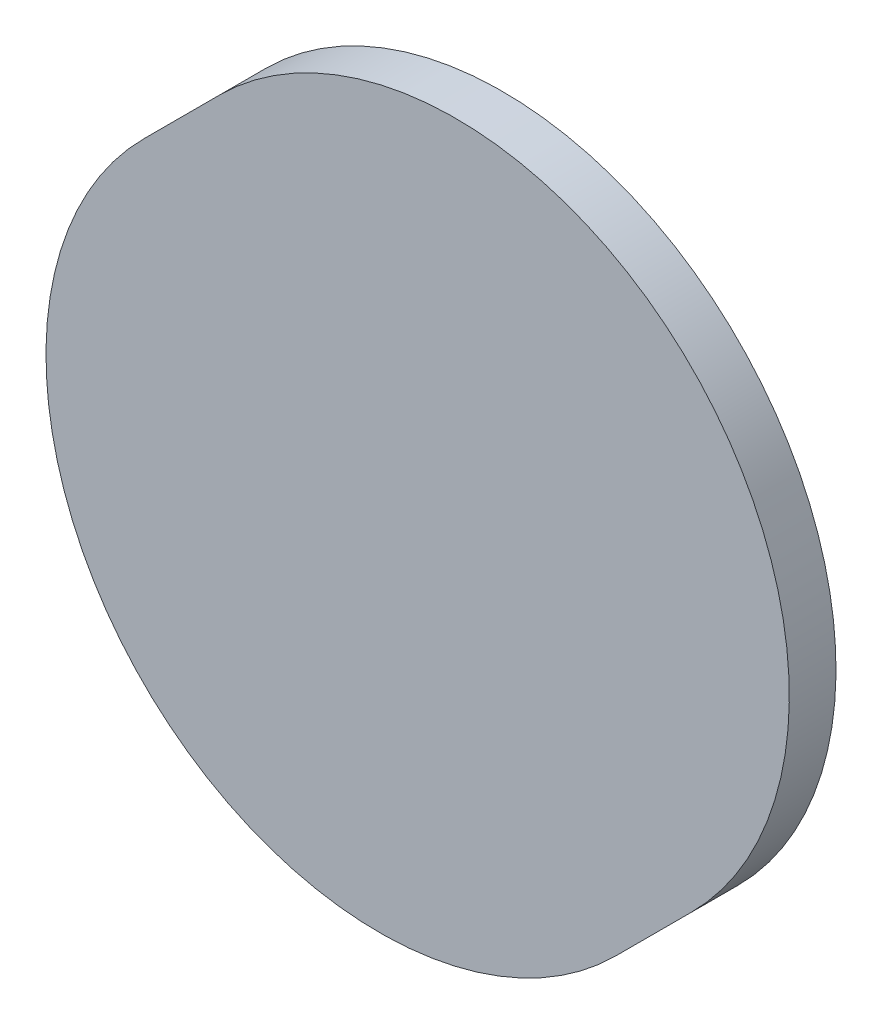
ISO-10303-21;
HEADER;
FILE_DESCRIPTION(('STEP AP214'),'2;1');
FILE_NAME('part.step','',(''),(''),'','','');
FILE_SCHEMA(('AUTOMOTIVE_DESIGN { 1 0 10303 214 1 1 1 1 }'));
ENDSEC;
DATA;
#1=APPLICATION_CONTEXT('core data for automotive mechanical design processes');
#2=APPLICATION_PROTOCOL_DEFINITION('international standard','automotive_design',2000,#1);
#3=PRODUCT_CONTEXT('',#1,'mechanical');
#4=PRODUCT('Part','Part','',(#3));
#5=PRODUCT_RELATED_PRODUCT_CATEGORY('part','',(#4));
#6=PRODUCT_DEFINITION_FORMATION('','',#4);
#7=PRODUCT_DEFINITION_CONTEXT('part definition',#1,'design');
#8=PRODUCT_DEFINITION('design','',#6,#7);
#9=PRODUCT_DEFINITION_SHAPE('','',#8);
#10=(LENGTH_UNIT() NAMED_UNIT(*) SI_UNIT(.MILLI.,.METRE.));
#11=(NAMED_UNIT(*) PLANE_ANGLE_UNIT() SI_UNIT($,.RADIAN.));
#12=(NAMED_UNIT(*) SI_UNIT($,.STERADIAN.) SOLID_ANGLE_UNIT());
#13=UNCERTAINTY_MEASURE_WITH_UNIT(LENGTH_MEASURE(1.E-05),#10,'distance_accuracy_value','');
#14=(GEOMETRIC_REPRESENTATION_CONTEXT(3) GLOBAL_UNCERTAINTY_ASSIGNED_CONTEXT((#13)) GLOBAL_UNIT_ASSIGNED_CONTEXT((#10,
#11,#12)) REPRESENTATION_CONTEXT('',''));
#15=CARTESIAN_POINT('',(0.,0.,0.));
#16=DIRECTION('',(0.,0.,1.));
#17=DIRECTION('',(1.,0.,0.));
#18=AXIS2_PLACEMENT_3D('',#15,#16,#17);
#19=CARTESIAN_POINT('',(113.276776,-118.266776,1.635));
#20=DIRECTION('',(0.,0.,1.));
#21=DIRECTION('',(1.,0.,0.));
#22=AXIS2_PLACEMENT_3D('',#19,#20,#21);
#23=PLANE('',#22);
#24=DIRECTION('',(0.707106781187048,0.707106781186048,0.));
#25=VECTOR('',#24,1.);
#26=CARTESIAN_POINT('',(113.276776,-118.266776,1.635));
#27=LINE('',#26,#25);
#28=CARTESIAN_POINT('',(113.276776,-118.266776,1.635));
#29=VERTEX_POINT('',#28);
#30=CARTESIAN_POINT('',(113.333776,-118.209776,1.635));
#31=VERTEX_POINT('',#30);
#32=EDGE_CURVE('E82',#29,#31,#27,.T.);
#33=ORIENTED_EDGE('',*,*,#32,.T.);
#34=CARTESIAN_POINT('',(113.1569995,-118.0329995,1.635));
#35=DIRECTION('',(0.,0.,1.));
#36=DIRECTION('',(0.707106781186548,-0.707106781186548,0.));
#37=AXIS2_PLACEMENT_3D('',#34,#35,#36);
#38=CIRCLE('',#37,0.249999723809);
#39=CARTESIAN_POINT('',(112.980223,-117.856223,1.635));
#40=VERTEX_POINT('',#39);
#41=EDGE_CURVE('E101',#31,#40,#38,.T.);
#42=ORIENTED_EDGE('',*,*,#41,.T.);
#43=DIRECTION('',(-0.707106781186548,-0.707106781186548,0.));
#44=VECTOR('',#43,1.);
#45=CARTESIAN_POINT('',(112.980223,-117.856223,1.635));
#46=LINE('',#45,#44);
#47=CARTESIAN_POINT('',(112.923223,-117.913223,1.635));
#48=VERTEX_POINT('',#47);
#49=EDGE_CURVE('E75',#40,#48,#46,.T.);
#50=ORIENTED_EDGE('',*,*,#49,.T.);
#51=CARTESIAN_POINT('',(113.0999995,-118.0899995,1.635));
#52=DIRECTION('',(0.,0.,1.));
#53=DIRECTION('',(-0.707106781186548,0.707106781186548,0.));
#54=AXIS2_PLACEMENT_3D('',#51,#52,#53);
#55=CIRCLE('',#54,0.249999723809);
#56=EDGE_CURVE('E11',#48,#29,#55,.T.);
#57=ORIENTED_EDGE('',*,*,#56,.T.);
#58=EDGE_LOOP('',(#33,#42,#50,#57));
#59=FACE_BOUND('',#58,.T.);
#60=ADVANCED_FACE('F17',(#59),#23,.T.);
#61=CARTESIAN_POINT('',(113.276776,-118.266776,1.6));
#62=DIRECTION('',(0.,0.,1.));
#63=DIRECTION('',(1.,0.,0.));
#64=AXIS2_PLACEMENT_3D('',#61,#62,#63);
#65=PLANE('',#64);
#66=CARTESIAN_POINT('',(113.0999995,-118.0899995,1.6));
#67=DIRECTION('',(0.,0.,1.));
#68=DIRECTION('',(-0.707106781186548,0.707106781186548,0.));
#69=AXIS2_PLACEMENT_3D('',#66,#67,#68);
#70=CIRCLE('',#69,0.249999723809);
#71=CARTESIAN_POINT('',(112.923223,-117.913223,1.6));
#72=VERTEX_POINT('',#71);
#73=CARTESIAN_POINT('',(113.276776,-118.266776,1.6));
#74=VERTEX_POINT('',#73);
#75=EDGE_CURVE('E20',#72,#74,#70,.T.);
#76=ORIENTED_EDGE('',*,*,#75,.F.);
#77=DIRECTION('',(-0.707106781186548,-0.707106781186548,0.));
#78=VECTOR('',#77,1.);
#79=CARTESIAN_POINT('',(112.980223,-117.856223,1.6));
#80=LINE('',#79,#78);
#81=CARTESIAN_POINT('',(112.980223,-117.856223,1.6));
#82=VERTEX_POINT('',#81);
#83=EDGE_CURVE('E99',#82,#72,#80,.T.);
#84=ORIENTED_EDGE('',*,*,#83,.F.);
#85=CARTESIAN_POINT('',(113.1569995,-118.0329995,1.6));
#86=DIRECTION('',(0.,0.,1.));
#87=DIRECTION('',(0.707106781186548,-0.707106781186548,0.));
#88=AXIS2_PLACEMENT_3D('',#85,#86,#87);
#89=CIRCLE('',#88,0.249999723809);
#90=CARTESIAN_POINT('',(113.333776,-118.209776,1.6));
#91=VERTEX_POINT('',#90);
#92=EDGE_CURVE('E84',#91,#82,#89,.T.);
#93=ORIENTED_EDGE('',*,*,#92,.F.);
#94=DIRECTION('',(0.707106781187048,0.707106781186048,0.));
#95=VECTOR('',#94,1.);
#96=CARTESIAN_POINT('',(113.276776,-118.266776,1.6));
#97=LINE('',#96,#95);
#98=EDGE_CURVE('E80',#74,#91,#97,.T.);
#99=ORIENTED_EDGE('',*,*,#98,.F.);
#100=EDGE_LOOP('',(#76,#84,#93,#99));
#101=FACE_BOUND('',#100,.T.);
#102=ADVANCED_FACE('F86',(#101),#65,.F.);
#103=CARTESIAN_POINT('',(113.0999995,-118.0899995,1.6));
#104=DIRECTION('',(0.,0.,-1.));
#105=DIRECTION('',(-0.707106781186548,0.707106781186548,0.));
#106=AXIS2_PLACEMENT_3D('',#103,#104,#105);
#107=CYLINDRICAL_SURFACE('',#106,0.249999723809);
#108=ORIENTED_EDGE('',*,*,#75,.T.);
#109=DIRECTION('',(0.,0.,1.));
#110=VECTOR('',#109,1.);
#111=CARTESIAN_POINT('',(113.276776,-118.266776,1.6));
#112=LINE('',#111,#110);
#113=EDGE_CURVE('E69',#74,#29,#112,.T.);
#114=ORIENTED_EDGE('',*,*,#113,.T.);
#115=ORIENTED_EDGE('',*,*,#56,.F.);
#116=DIRECTION('',(0.,0.,1.));
#117=VECTOR('',#116,1.);
#118=CARTESIAN_POINT('',(112.923223,-117.913223,1.6));
#119=LINE('',#118,#117);
#120=EDGE_CURVE('E72',#72,#48,#119,.T.);
#121=ORIENTED_EDGE('',*,*,#120,.F.);
#122=EDGE_LOOP('',(#108,#114,#115,#121));
#123=FACE_BOUND('',#122,.T.);
#124=ADVANCED_FACE('F68',(#123),#107,.T.);
#125=CARTESIAN_POINT('',(112.980223,-117.856223,1.6));
#126=DIRECTION('',(0.707106781186548,-0.707106781186548,0.));
#127=DIRECTION('',(0.,0.,-1.));
#128=AXIS2_PLACEMENT_3D('',#125,#126,#127);
#129=PLANE('',#128);
#130=ORIENTED_EDGE('',*,*,#83,.T.);
#131=ORIENTED_EDGE('',*,*,#120,.T.);
#132=ORIENTED_EDGE('',*,*,#49,.F.);
#133=DIRECTION('',(0.,0.,1.));
#134=VECTOR('',#133,1.);
#135=CARTESIAN_POINT('',(112.980223,-117.856223,1.6));
#136=LINE('',#135,#134);
#137=EDGE_CURVE('E107',#82,#40,#136,.T.);
#138=ORIENTED_EDGE('',*,*,#137,.F.);
#139=EDGE_LOOP('',(#130,#131,#132,#138));
#140=FACE_BOUND('',#139,.T.);
#141=ADVANCED_FACE('F121',(#140),#129,.F.);
#142=CARTESIAN_POINT('',(113.1569995,-118.0329995,1.6));
#143=DIRECTION('',(0.,0.,-1.));
#144=DIRECTION('',(0.707106781186548,-0.707106781186548,0.));
#145=AXIS2_PLACEMENT_3D('',#142,#143,#144);
#146=CYLINDRICAL_SURFACE('',#145,0.249999723809);
#147=ORIENTED_EDGE('',*,*,#92,.T.);
#148=ORIENTED_EDGE('',*,*,#137,.T.);
#149=ORIENTED_EDGE('',*,*,#41,.F.);
#150=DIRECTION('',(0.,0.,1.));
#151=VECTOR('',#150,1.);
#152=CARTESIAN_POINT('',(113.333776,-118.209776,1.6));
#153=LINE('',#152,#151);
#154=EDGE_CURVE('E90',#91,#31,#153,.T.);
#155=ORIENTED_EDGE('',*,*,#154,.F.);
#156=EDGE_LOOP('',(#147,#148,#149,#155));
#157=FACE_BOUND('',#156,.T.);
#158=ADVANCED_FACE('F124',(#157),#146,.T.);
#159=CARTESIAN_POINT('',(113.276776,-118.266776,1.6));
#160=DIRECTION('',(-0.707106781186048,0.707106781187048,0.));
#161=DIRECTION('',(0.,0.,1.));
#162=AXIS2_PLACEMENT_3D('',#159,#160,#161);
#163=PLANE('',#162);
#164=ORIENTED_EDGE('',*,*,#98,.T.);
#165=ORIENTED_EDGE('',*,*,#154,.T.);
#166=ORIENTED_EDGE('',*,*,#32,.F.);
#167=ORIENTED_EDGE('',*,*,#113,.F.);
#168=EDGE_LOOP('',(#164,#165,#166,#167));
#169=FACE_BOUND('',#168,.T.);
#170=ADVANCED_FACE('F78',(#169),#163,.F.);
#171=CLOSED_SHELL('',(#60,#102,#124,#141,#158,#170));
#172=MANIFOLD_SOLID_BREP('B1',#171);
#173=ADVANCED_BREP_SHAPE_REPRESENTATION('',(#18,#172),#14);
#174=SHAPE_DEFINITION_REPRESENTATION(#9,#173);
ENDSEC;
END-ISO-10303-21;
